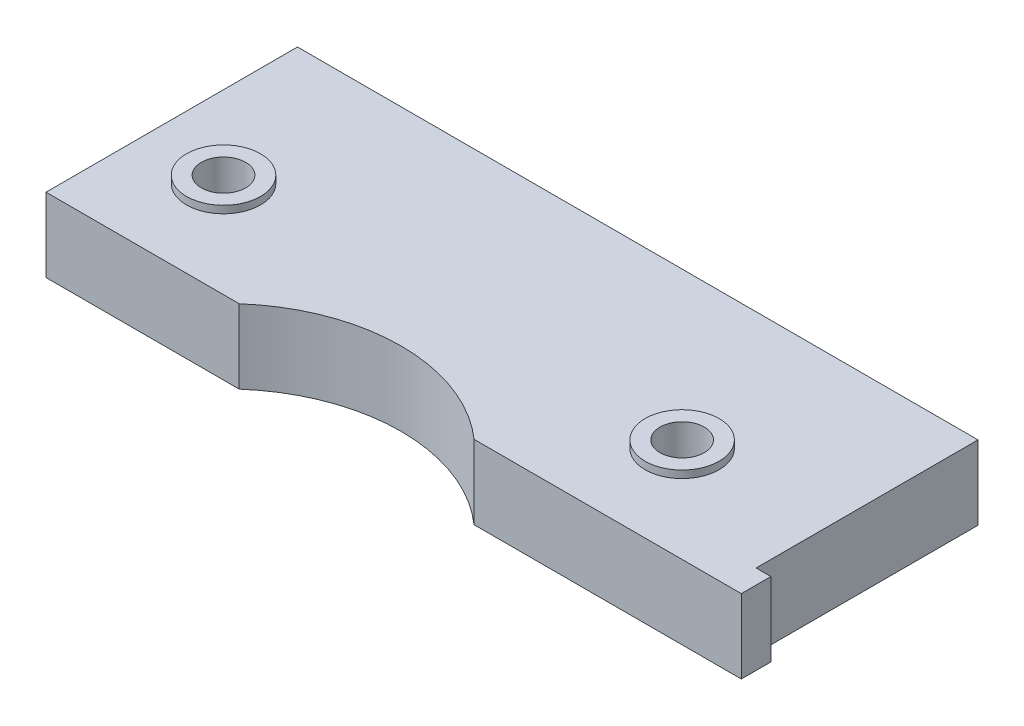
ISO-10303-21;
HEADER;
FILE_DESCRIPTION(('STEP AP214'),'2;1');
FILE_NAME('part.step','',(''),(''),'','','');
FILE_SCHEMA(('AUTOMOTIVE_DESIGN { 1 0 10303 214 1 1 1 1 }'));
ENDSEC;
DATA;
#1=APPLICATION_CONTEXT('core data for automotive mechanical design processes');
#2=APPLICATION_PROTOCOL_DEFINITION('international standard','automotive_design',2000,#1);
#3=PRODUCT_CONTEXT('',#1,'mechanical');
#4=PRODUCT('Part','Part','',(#3));
#5=PRODUCT_RELATED_PRODUCT_CATEGORY('part','',(#4));
#6=PRODUCT_DEFINITION_FORMATION('','',#4);
#7=PRODUCT_DEFINITION_CONTEXT('part definition',#1,'design');
#8=PRODUCT_DEFINITION('design','',#6,#7);
#9=PRODUCT_DEFINITION_SHAPE('','',#8);
#10=(LENGTH_UNIT() NAMED_UNIT(*) SI_UNIT(.MILLI.,.METRE.));
#11=(NAMED_UNIT(*) PLANE_ANGLE_UNIT() SI_UNIT($,.RADIAN.));
#12=(NAMED_UNIT(*) SI_UNIT($,.STERADIAN.) SOLID_ANGLE_UNIT());
#13=UNCERTAINTY_MEASURE_WITH_UNIT(LENGTH_MEASURE(1.E-05),#10,'distance_accuracy_value','');
#14=(GEOMETRIC_REPRESENTATION_CONTEXT(3) GLOBAL_UNCERTAINTY_ASSIGNED_CONTEXT((#13)) GLOBAL_UNIT_ASSIGNED_CONTEXT((#10,
#11,#12)) REPRESENTATION_CONTEXT('',''));
#15=CARTESIAN_POINT('',(0.,0.,0.));
#16=DIRECTION('',(0.,0.,1.));
#17=DIRECTION('',(1.,0.,0.));
#18=AXIS2_PLACEMENT_3D('',#15,#16,#17);
#19=CARTESIAN_POINT('',(15.5,5.,15.5));
#20=DIRECTION('',(0.,1.,0.));
#21=DIRECTION('',(0.,0.,1.));
#22=AXIS2_PLACEMENT_3D('',#19,#20,#21);
#23=PLANE('',#22);
#24=CARTESIAN_POINT('',(0.,5.,0.));
#25=DIRECTION('',(0.,1.,0.));
#26=DIRECTION('',(0.,0.,1.));
#27=AXIS2_PLACEMENT_3D('',#24,#25,#26);
#28=CIRCLE('',#27,2.5);
#29=CARTESIAN_POINT('',(0.,5.,2.5));
#30=VERTEX_POINT('',#29);
#31=EDGE_CURVE('E184',#30,#30,#28,.T.);
#32=ORIENTED_EDGE('',*,*,#31,.F.);
#33=EDGE_LOOP('',(#32));
#34=FACE_BOUND('',#33,.T.);
#35=DIRECTION('',(-1.,0.,0.));
#36=VECTOR('',#35,1.);
#37=CARTESIAN_POINT('',(41.5,5.,4.5));
#38=LINE('',#37,#36);
#39=CARTESIAN_POINT('',(41.5,5.,4.5));
#40=VERTEX_POINT('',#39);
#41=CARTESIAN_POINT('',(40.5,5.,4.5));
#42=VERTEX_POINT('',#41);
#43=EDGE_CURVE('E144',#40,#42,#38,.T.);
#44=ORIENTED_EDGE('',*,*,#43,.T.);
#45=DIRECTION('',(0.,0.,-1.));
#46=VECTOR('',#45,1.);
#47=CARTESIAN_POINT('',(40.5,5.,-10.5));
#48=LINE('',#47,#46);
#49=CARTESIAN_POINT('',(40.5,5.,-10.5));
#50=VERTEX_POINT('',#49);
#51=EDGE_CURVE('E91',#42,#50,#48,.T.);
#52=ORIENTED_EDGE('',*,*,#51,.T.);
#53=DIRECTION('',(-1.,0.,0.));
#54=VECTOR('',#53,1.);
#55=CARTESIAN_POINT('',(-5.5,5.,-10.5));
#56=LINE('',#55,#54);
#57=CARTESIAN_POINT('',(-5.5,5.,-10.5));
#58=VERTEX_POINT('',#57);
#59=EDGE_CURVE('E159',#50,#58,#56,.T.);
#60=ORIENTED_EDGE('',*,*,#59,.T.);
#61=DIRECTION('',(0.,0.,1.));
#62=VECTOR('',#61,1.);
#63=CARTESIAN_POINT('',(-5.5,5.,-10.5));
#64=LINE('',#63,#62);
#65=CARTESIAN_POINT('',(-5.5,5.,6.5));
#66=VERTEX_POINT('',#65);
#67=EDGE_CURVE('E172',#58,#66,#64,.T.);
#68=ORIENTED_EDGE('',*,*,#67,.T.);
#69=DIRECTION('',(1.,0.,0.));
#70=VECTOR('',#69,1.);
#71=CARTESIAN_POINT('',(-5.5,5.,6.5));
#72=LINE('',#71,#70);
#73=CARTESIAN_POINT('',(7.56274606680623,5.,6.5));
#74=VERTEX_POINT('',#73);
#75=EDGE_CURVE('E110',#66,#74,#72,.T.);
#76=ORIENTED_EDGE('',*,*,#75,.T.);
#77=CARTESIAN_POINT('',(15.5,5.,15.5));
#78=DIRECTION('',(0.,-1.,0.));
#79=DIRECTION('',(0.,0.,1.));
#80=AXIS2_PLACEMENT_3D('',#77,#78,#79);
#81=CIRCLE('',#80,12.);
#82=CARTESIAN_POINT('',(23.4372539331938,5.,6.5));
#83=VERTEX_POINT('',#82);
#84=EDGE_CURVE('E104',#74,#83,#81,.T.);
#85=ORIENTED_EDGE('',*,*,#84,.T.);
#86=DIRECTION('',(1.,0.,0.));
#87=VECTOR('',#86,1.);
#88=CARTESIAN_POINT('',(23.4372539331938,5.,6.5));
#89=LINE('',#88,#87);
#90=CARTESIAN_POINT('',(41.5,5.,6.5));
#91=VERTEX_POINT('',#90);
#92=EDGE_CURVE('E108',#83,#91,#89,.T.);
#93=ORIENTED_EDGE('',*,*,#92,.T.);
#94=DIRECTION('',(0.,0.,-1.));
#95=VECTOR('',#94,1.);
#96=CARTESIAN_POINT('',(41.5,5.,6.5));
#97=LINE('',#96,#95);
#98=EDGE_CURVE('E49',#91,#40,#97,.T.);
#99=ORIENTED_EDGE('',*,*,#98,.T.);
#100=EDGE_LOOP('',(#44,#52,#60,#68,#76,#85,#93,#99));
#101=FACE_BOUND('',#100,.T.);
#102=CARTESIAN_POINT('',(31.,5.,0.));
#103=DIRECTION('',(0.,1.,0.));
#104=DIRECTION('',(0.,0.,1.));
#105=AXIS2_PLACEMENT_3D('',#102,#103,#104);
#106=CIRCLE('',#105,2.5);
#107=CARTESIAN_POINT('',(31.,5.,2.5));
#108=VERTEX_POINT('',#107);
#109=EDGE_CURVE('E193',#108,#108,#106,.T.);
#110=ORIENTED_EDGE('',*,*,#109,.F.);
#111=EDGE_LOOP('',(#110));
#112=FACE_BOUND('',#111,.T.);
#113=ADVANCED_FACE('F32',(#34,#101,#112),#23,.T.);
#114=CARTESIAN_POINT('',(15.5,0.,15.5));
#115=DIRECTION('',(0.,1.,0.));
#116=DIRECTION('',(0.,0.,1.));
#117=AXIS2_PLACEMENT_3D('',#114,#115,#116);
#118=PLANE('',#117);
#119=DIRECTION('',(-1.,0.,0.));
#120=VECTOR('',#119,1.);
#121=CARTESIAN_POINT('',(41.5,0.,4.5));
#122=LINE('',#121,#120);
#123=CARTESIAN_POINT('',(41.5,0.,4.5));
#124=VERTEX_POINT('',#123);
#125=CARTESIAN_POINT('',(40.5,0.,4.5));
#126=VERTEX_POINT('',#125);
#127=EDGE_CURVE('E129',#124,#126,#122,.T.);
#128=ORIENTED_EDGE('',*,*,#127,.F.);
#129=DIRECTION('',(0.,0.,-1.));
#130=VECTOR('',#129,1.);
#131=CARTESIAN_POINT('',(41.5,0.,6.5));
#132=LINE('',#131,#130);
#133=CARTESIAN_POINT('',(41.5,0.,6.5));
#134=VERTEX_POINT('',#133);
#135=EDGE_CURVE('E83',#134,#124,#132,.T.);
#136=ORIENTED_EDGE('',*,*,#135,.F.);
#137=DIRECTION('',(1.,0.,0.));
#138=VECTOR('',#137,1.);
#139=CARTESIAN_POINT('',(40.5,0.,6.5));
#140=LINE('',#139,#138);
#141=CARTESIAN_POINT('',(23.4372539331938,0.,6.5));
#142=VERTEX_POINT('',#141);
#143=EDGE_CURVE('E77',#142,#134,#140,.T.);
#144=ORIENTED_EDGE('',*,*,#143,.F.);
#145=CARTESIAN_POINT('',(15.5,0.,15.5));
#146=DIRECTION('',(0.,-1.,0.));
#147=DIRECTION('',(0.,0.,1.));
#148=AXIS2_PLACEMENT_3D('',#145,#146,#147);
#149=CIRCLE('',#148,12.);
#150=CARTESIAN_POINT('',(7.56274606680623,0.,6.5));
#151=VERTEX_POINT('',#150);
#152=EDGE_CURVE('E119',#151,#142,#149,.T.);
#153=ORIENTED_EDGE('',*,*,#152,.F.);
#154=DIRECTION('',(1.,0.,0.));
#155=VECTOR('',#154,1.);
#156=CARTESIAN_POINT('',(-5.5,0.,6.5));
#157=LINE('',#156,#155);
#158=CARTESIAN_POINT('',(-5.5,0.,6.5));
#159=VERTEX_POINT('',#158);
#160=EDGE_CURVE('E139',#159,#151,#157,.T.);
#161=ORIENTED_EDGE('',*,*,#160,.F.);
#162=DIRECTION('',(0.,0.,1.));
#163=VECTOR('',#162,1.);
#164=CARTESIAN_POINT('',(-5.5,0.,-10.5));
#165=LINE('',#164,#163);
#166=CARTESIAN_POINT('',(-5.5,0.,-10.5));
#167=VERTEX_POINT('',#166);
#168=EDGE_CURVE('E137',#167,#159,#165,.T.);
#169=ORIENTED_EDGE('',*,*,#168,.F.);
#170=DIRECTION('',(-1.,0.,0.));
#171=VECTOR('',#170,1.);
#172=CARTESIAN_POINT('',(-5.5,0.,-10.5));
#173=LINE('',#172,#171);
#174=CARTESIAN_POINT('',(40.5,0.,-10.5));
#175=VERTEX_POINT('',#174);
#176=EDGE_CURVE('E135',#175,#167,#173,.T.);
#177=ORIENTED_EDGE('',*,*,#176,.F.);
#178=DIRECTION('',(0.,0.,-1.));
#179=VECTOR('',#178,1.);
#180=CARTESIAN_POINT('',(40.5,0.,-10.5));
#181=LINE('',#180,#179);
#182=EDGE_CURVE('E132',#126,#175,#181,.T.);
#183=ORIENTED_EDGE('',*,*,#182,.F.);
#184=EDGE_LOOP('',(#128,#136,#144,#153,#161,#169,#177,#183));
#185=FACE_BOUND('',#184,.T.);
#186=CARTESIAN_POINT('',(0.,0.,0.));
#187=DIRECTION('',(0.,1.,0.));
#188=DIRECTION('',(0.,0.,1.));
#189=AXIS2_PLACEMENT_3D('',#186,#187,#188);
#190=CIRCLE('',#189,1.5);
#191=CARTESIAN_POINT('',(0.,0.,1.5));
#192=VERTEX_POINT('',#191);
#193=EDGE_CURVE('E133',#192,#192,#190,.T.);
#194=ORIENTED_EDGE('',*,*,#193,.T.);
#195=EDGE_LOOP('',(#194));
#196=FACE_BOUND('',#195,.T.);
#197=CARTESIAN_POINT('',(31.,0.,0.));
#198=DIRECTION('',(0.,1.,0.));
#199=DIRECTION('',(0.,0.,1.));
#200=AXIS2_PLACEMENT_3D('',#197,#198,#199);
#201=CIRCLE('',#200,1.5);
#202=CARTESIAN_POINT('',(31.,0.,1.5));
#203=VERTEX_POINT('',#202);
#204=EDGE_CURVE('E180',#203,#203,#201,.T.);
#205=ORIENTED_EDGE('',*,*,#204,.T.);
#206=EDGE_LOOP('',(#205));
#207=FACE_BOUND('',#206,.T.);
#208=ADVANCED_FACE('F163',(#185,#196,#207),#118,.F.);
#209=CARTESIAN_POINT('',(41.5,5.,4.5));
#210=DIRECTION('',(0.,0.,1.));
#211=DIRECTION('',(1.,0.,0.));
#212=AXIS2_PLACEMENT_3D('',#209,#210,#211);
#213=PLANE('',#212);
#214=ORIENTED_EDGE('',*,*,#127,.T.);
#215=DIRECTION('',(0.,-1.,0.));
#216=VECTOR('',#215,1.);
#217=CARTESIAN_POINT('',(40.5,5.,4.5));
#218=LINE('',#217,#216);
#219=EDGE_CURVE('E11',#42,#126,#218,.T.);
#220=ORIENTED_EDGE('',*,*,#219,.F.);
#221=ORIENTED_EDGE('',*,*,#43,.F.);
#222=DIRECTION('',(0.,-1.,0.));
#223=VECTOR('',#222,1.);
#224=CARTESIAN_POINT('',(41.5,5.,4.5));
#225=LINE('',#224,#223);
#226=EDGE_CURVE('E125',#40,#124,#225,.T.);
#227=ORIENTED_EDGE('',*,*,#226,.T.);
#228=EDGE_LOOP('',(#214,#220,#221,#227));
#229=FACE_BOUND('',#228,.T.);
#230=ADVANCED_FACE('F34',(#229),#213,.F.);
#231=CARTESIAN_POINT('',(40.5,5.,-10.5));
#232=DIRECTION('',(-1.,0.,0.));
#233=DIRECTION('',(0.,0.,1.));
#234=AXIS2_PLACEMENT_3D('',#231,#232,#233);
#235=PLANE('',#234);
#236=ORIENTED_EDGE('',*,*,#182,.T.);
#237=DIRECTION('',(0.,-1.,0.));
#238=VECTOR('',#237,1.);
#239=CARTESIAN_POINT('',(40.5,5.,-10.5));
#240=LINE('',#239,#238);
#241=EDGE_CURVE('E41',#50,#175,#240,.T.);
#242=ORIENTED_EDGE('',*,*,#241,.F.);
#243=ORIENTED_EDGE('',*,*,#51,.F.);
#244=ORIENTED_EDGE('',*,*,#219,.T.);
#245=EDGE_LOOP('',(#236,#242,#243,#244));
#246=FACE_BOUND('',#245,.T.);
#247=ADVANCED_FACE('F243',(#246),#235,.F.);
#248=CARTESIAN_POINT('',(-5.5,5.,-10.5));
#249=DIRECTION('',(0.,0.,1.));
#250=DIRECTION('',(1.,0.,0.));
#251=AXIS2_PLACEMENT_3D('',#248,#249,#250);
#252=PLANE('',#251);
#253=ORIENTED_EDGE('',*,*,#176,.T.);
#254=DIRECTION('',(0.,-1.,0.));
#255=VECTOR('',#254,1.);
#256=CARTESIAN_POINT('',(-5.5,5.,-10.5));
#257=LINE('',#256,#255);
#258=EDGE_CURVE('E151',#58,#167,#257,.T.);
#259=ORIENTED_EDGE('',*,*,#258,.F.);
#260=ORIENTED_EDGE('',*,*,#59,.F.);
#261=ORIENTED_EDGE('',*,*,#241,.T.);
#262=EDGE_LOOP('',(#253,#259,#260,#261));
#263=FACE_BOUND('',#262,.T.);
#264=ADVANCED_FACE('F157',(#263),#252,.F.);
#265=CARTESIAN_POINT('',(-5.5,5.,-10.5));
#266=DIRECTION('',(1.,0.,0.));
#267=DIRECTION('',(0.,0.,-1.));
#268=AXIS2_PLACEMENT_3D('',#265,#266,#267);
#269=PLANE('',#268);
#270=ORIENTED_EDGE('',*,*,#168,.T.);
#271=DIRECTION('',(0.,-1.,0.));
#272=VECTOR('',#271,1.);
#273=CARTESIAN_POINT('',(-5.5,5.,6.5));
#274=LINE('',#273,#272);
#275=EDGE_CURVE('E148',#66,#159,#274,.T.);
#276=ORIENTED_EDGE('',*,*,#275,.F.);
#277=ORIENTED_EDGE('',*,*,#67,.F.);
#278=ORIENTED_EDGE('',*,*,#258,.T.);
#279=EDGE_LOOP('',(#270,#276,#277,#278));
#280=FACE_BOUND('',#279,.T.);
#281=ADVANCED_FACE('F168',(#280),#269,.F.);
#282=CARTESIAN_POINT('',(-5.5,5.,6.5));
#283=DIRECTION('',(0.,0.,-1.));
#284=DIRECTION('',(-1.,0.,0.));
#285=AXIS2_PLACEMENT_3D('',#282,#283,#284);
#286=PLANE('',#285);
#287=ORIENTED_EDGE('',*,*,#160,.T.);
#288=DIRECTION('',(0.,-1.,0.));
#289=VECTOR('',#288,1.);
#290=CARTESIAN_POINT('',(7.56274606680623,5.,6.5));
#291=LINE('',#290,#289);
#292=EDGE_CURVE('E120',#74,#151,#291,.T.);
#293=ORIENTED_EDGE('',*,*,#292,.F.);
#294=ORIENTED_EDGE('',*,*,#75,.F.);
#295=ORIENTED_EDGE('',*,*,#275,.T.);
#296=EDGE_LOOP('',(#287,#293,#294,#295));
#297=FACE_BOUND('',#296,.T.);
#298=ADVANCED_FACE('F171',(#297),#286,.F.);
#299=CARTESIAN_POINT('',(15.5,5.,15.5));
#300=DIRECTION('',(0.,-1.,0.));
#301=DIRECTION('',(0.,0.,-1.));
#302=AXIS2_PLACEMENT_3D('',#299,#300,#301);
#303=CYLINDRICAL_SURFACE('',#302,12.);
#304=ORIENTED_EDGE('',*,*,#152,.T.);
#305=DIRECTION('',(0.,-1.,0.));
#306=VECTOR('',#305,1.);
#307=CARTESIAN_POINT('',(23.4372539331938,5.,6.5));
#308=LINE('',#307,#306);
#309=EDGE_CURVE('E116',#83,#142,#308,.T.);
#310=ORIENTED_EDGE('',*,*,#309,.F.);
#311=ORIENTED_EDGE('',*,*,#84,.F.);
#312=ORIENTED_EDGE('',*,*,#292,.T.);
#313=EDGE_LOOP('',(#304,#310,#311,#312));
#314=FACE_BOUND('',#313,.T.);
#315=ADVANCED_FACE('F117',(#314),#303,.F.);
#316=CARTESIAN_POINT('',(40.5,5.,6.5));
#317=DIRECTION('',(0.,0.,-1.));
#318=DIRECTION('',(-1.,0.,0.));
#319=AXIS2_PLACEMENT_3D('',#316,#317,#318);
#320=PLANE('',#319);
#321=ORIENTED_EDGE('',*,*,#143,.T.);
#322=DIRECTION('',(0.,-1.,0.));
#323=VECTOR('',#322,1.);
#324=CARTESIAN_POINT('',(41.5,5.,6.5));
#325=LINE('',#324,#323);
#326=EDGE_CURVE('E121',#91,#134,#325,.T.);
#327=ORIENTED_EDGE('',*,*,#326,.F.);
#328=ORIENTED_EDGE('',*,*,#92,.F.);
#329=ORIENTED_EDGE('',*,*,#309,.T.);
#330=EDGE_LOOP('',(#321,#327,#328,#329));
#331=FACE_BOUND('',#330,.T.);
#332=ADVANCED_FACE('F123',(#331),#320,.F.);
#333=CARTESIAN_POINT('',(41.5,5.,6.5));
#334=DIRECTION('',(-1.,0.,0.));
#335=DIRECTION('',(0.,0.,1.));
#336=AXIS2_PLACEMENT_3D('',#333,#334,#335);
#337=PLANE('',#336);
#338=ORIENTED_EDGE('',*,*,#135,.T.);
#339=ORIENTED_EDGE('',*,*,#226,.F.);
#340=ORIENTED_EDGE('',*,*,#98,.F.);
#341=ORIENTED_EDGE('',*,*,#326,.T.);
#342=EDGE_LOOP('',(#338,#339,#340,#341));
#343=FACE_BOUND('',#342,.T.);
#344=ADVANCED_FACE('F231',(#343),#337,.F.);
#345=CARTESIAN_POINT('',(0.,5.,0.));
#346=DIRECTION('',(0.,-1.,0.));
#347=DIRECTION('',(0.,0.,-1.));
#348=AXIS2_PLACEMENT_3D('',#345,#346,#347);
#349=CYLINDRICAL_SURFACE('',#348,1.5);
#350=ORIENTED_EDGE('',*,*,#193,.F.);
#351=EDGE_LOOP('',(#350));
#352=FACE_BOUND('',#351,.T.);
#353=CARTESIAN_POINT('',(0.,5.5,0.));
#354=DIRECTION('',(0.,1.,0.));
#355=DIRECTION('',(0.,0.,1.));
#356=AXIS2_PLACEMENT_3D('',#353,#354,#355);
#357=CIRCLE('',#356,1.5);
#358=CARTESIAN_POINT('',(0.,5.5,1.5));
#359=VERTEX_POINT('',#358);
#360=EDGE_CURVE('E187',#359,#359,#357,.T.);
#361=ORIENTED_EDGE('',*,*,#360,.T.);
#362=EDGE_LOOP('',(#361));
#363=FACE_BOUND('',#362,.T.);
#364=ADVANCED_FACE('F228',(#352,#363),#349,.F.);
#365=CARTESIAN_POINT('',(31.,5.,0.));
#366=DIRECTION('',(0.,-1.,0.));
#367=DIRECTION('',(0.,0.,-1.));
#368=AXIS2_PLACEMENT_3D('',#365,#366,#367);
#369=CYLINDRICAL_SURFACE('',#368,1.5);
#370=ORIENTED_EDGE('',*,*,#204,.F.);
#371=EDGE_LOOP('',(#370));
#372=FACE_BOUND('',#371,.T.);
#373=CARTESIAN_POINT('',(31.,5.5,0.));
#374=DIRECTION('',(0.,1.,0.));
#375=DIRECTION('',(0.,0.,1.));
#376=AXIS2_PLACEMENT_3D('',#373,#374,#375);
#377=CIRCLE('',#376,1.5);
#378=CARTESIAN_POINT('',(31.,5.5,1.5));
#379=VERTEX_POINT('',#378);
#380=EDGE_CURVE('E196',#379,#379,#377,.T.);
#381=ORIENTED_EDGE('',*,*,#380,.T.);
#382=EDGE_LOOP('',(#381));
#383=FACE_BOUND('',#382,.T.);
#384=ADVANCED_FACE('F202',(#372,#383),#369,.F.);
#385=CARTESIAN_POINT('',(0.,5.5,0.));
#386=DIRECTION('',(0.,1.,0.));
#387=DIRECTION('',(0.,0.,1.));
#388=AXIS2_PLACEMENT_3D('',#385,#386,#387);
#389=PLANE('',#388);
#390=CARTESIAN_POINT('',(0.,5.5,0.));
#391=DIRECTION('',(0.,1.,0.));
#392=DIRECTION('',(0.,0.,1.));
#393=AXIS2_PLACEMENT_3D('',#390,#391,#392);
#394=CIRCLE('',#393,2.5);
#395=CARTESIAN_POINT('',(0.,5.5,2.5));
#396=VERTEX_POINT('',#395);
#397=EDGE_CURVE('E183',#396,#396,#394,.T.);
#398=ORIENTED_EDGE('',*,*,#397,.T.);
#399=EDGE_LOOP('',(#398));
#400=FACE_BOUND('',#399,.T.);
#401=ORIENTED_EDGE('',*,*,#360,.F.);
#402=EDGE_LOOP('',(#401));
#403=FACE_BOUND('',#402,.T.);
#404=ADVANCED_FACE('F216',(#400,#403),#389,.T.);
#405=CARTESIAN_POINT('',(0.,5.5,0.));
#406=DIRECTION('',(0.,-1.,0.));
#407=DIRECTION('',(0.,0.,-1.));
#408=AXIS2_PLACEMENT_3D('',#405,#406,#407);
#409=CYLINDRICAL_SURFACE('',#408,2.5);
#410=ORIENTED_EDGE('',*,*,#397,.F.);
#411=EDGE_LOOP('',(#410));
#412=FACE_BOUND('',#411,.T.);
#413=ORIENTED_EDGE('',*,*,#31,.T.);
#414=EDGE_LOOP('',(#413));
#415=FACE_BOUND('',#414,.T.);
#416=ADVANCED_FACE('F207',(#412,#415),#409,.T.);
#417=CARTESIAN_POINT('',(31.,5.5,0.));
#418=DIRECTION('',(0.,1.,0.));
#419=DIRECTION('',(0.,0.,1.));
#420=AXIS2_PLACEMENT_3D('',#417,#418,#419);
#421=PLANE('',#420);
#422=CARTESIAN_POINT('',(31.,5.5,0.));
#423=DIRECTION('',(0.,1.,0.));
#424=DIRECTION('',(0.,0.,1.));
#425=AXIS2_PLACEMENT_3D('',#422,#423,#424);
#426=CIRCLE('',#425,2.5);
#427=CARTESIAN_POINT('',(31.,5.5,2.5));
#428=VERTEX_POINT('',#427);
#429=EDGE_CURVE('E192',#428,#428,#426,.T.);
#430=ORIENTED_EDGE('',*,*,#429,.T.);
#431=EDGE_LOOP('',(#430));
#432=FACE_BOUND('',#431,.T.);
#433=ORIENTED_EDGE('',*,*,#380,.F.);
#434=EDGE_LOOP('',(#433));
#435=FACE_BOUND('',#434,.T.);
#436=ADVANCED_FACE('F204',(#432,#435),#421,.T.);
#437=CARTESIAN_POINT('',(31.,5.5,0.));
#438=DIRECTION('',(0.,-1.,0.));
#439=DIRECTION('',(0.,0.,-1.));
#440=AXIS2_PLACEMENT_3D('',#437,#438,#439);
#441=CYLINDRICAL_SURFACE('',#440,2.5);
#442=ORIENTED_EDGE('',*,*,#429,.F.);
#443=EDGE_LOOP('',(#442));
#444=FACE_BOUND('',#443,.T.);
#445=ORIENTED_EDGE('',*,*,#109,.T.);
#446=EDGE_LOOP('',(#445));
#447=FACE_BOUND('',#446,.T.);
#448=ADVANCED_FACE('F206',(#444,#447),#441,.T.);
#449=CLOSED_SHELL('',(#113,#208,#230,#247,#264,#281,#298,#315,#332,#344,#364,#384,#404,#416,
#436,#448));
#450=MANIFOLD_SOLID_BREP('B2',#449);
#451=ADVANCED_BREP_SHAPE_REPRESENTATION('',(#18,#450),#14);
#452=SHAPE_DEFINITION_REPRESENTATION(#9,#451);
ENDSEC;
END-ISO-10303-21;
